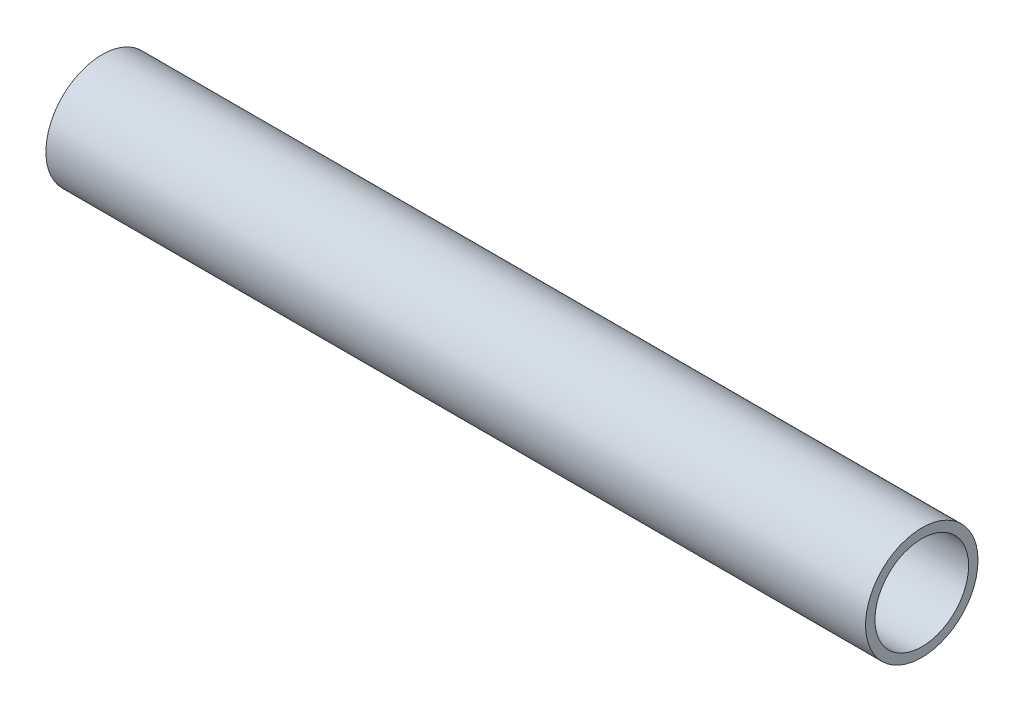
ISO-10303-21;
HEADER;
FILE_DESCRIPTION(('STEP AP214'),'2;1');
FILE_NAME('part.step','',(''),(''),'','','');
FILE_SCHEMA(('AUTOMOTIVE_DESIGN { 1 0 10303 214 1 1 1 1 }'));
ENDSEC;
DATA;
#1=APPLICATION_CONTEXT('core data for automotive mechanical design processes');
#2=APPLICATION_PROTOCOL_DEFINITION('international standard','automotive_design',2000,#1);
#3=PRODUCT_CONTEXT('',#1,'mechanical');
#4=PRODUCT('Part','Part','',(#3));
#5=PRODUCT_RELATED_PRODUCT_CATEGORY('part','',(#4));
#6=PRODUCT_DEFINITION_FORMATION('','',#4);
#7=PRODUCT_DEFINITION_CONTEXT('part definition',#1,'design');
#8=PRODUCT_DEFINITION('design','',#6,#7);
#9=PRODUCT_DEFINITION_SHAPE('','',#8);
#10=(LENGTH_UNIT() NAMED_UNIT(*) SI_UNIT(.MILLI.,.METRE.));
#11=(NAMED_UNIT(*) PLANE_ANGLE_UNIT() SI_UNIT($,.RADIAN.));
#12=(NAMED_UNIT(*) SI_UNIT($,.STERADIAN.) SOLID_ANGLE_UNIT());
#13=UNCERTAINTY_MEASURE_WITH_UNIT(LENGTH_MEASURE(1.E-05),#10,'distance_accuracy_value','');
#14=(GEOMETRIC_REPRESENTATION_CONTEXT(3) GLOBAL_UNCERTAINTY_ASSIGNED_CONTEXT((#13)) GLOBAL_UNIT_ASSIGNED_CONTEXT((#10,
#11,#12)) REPRESENTATION_CONTEXT('',''));
#15=CARTESIAN_POINT('',(0.,0.,0.));
#16=DIRECTION('',(0.,0.,1.));
#17=DIRECTION('',(1.,0.,0.));
#18=AXIS2_PLACEMENT_3D('',#15,#16,#17);
#19=CARTESIAN_POINT('',(35.,0.,0.));
#20=DIRECTION('',(1.,0.,0.));
#21=DIRECTION('',(0.,0.,-1.));
#22=AXIS2_PLACEMENT_3D('',#19,#20,#21);
#23=PLANE('',#22);
#24=CARTESIAN_POINT('',(35.,0.,0.));
#25=DIRECTION('',(1.,0.,0.));
#26=DIRECTION('',(0.,0.,-1.));
#27=AXIS2_PLACEMENT_3D('',#24,#25,#26);
#28=CIRCLE('',#27,2.4);
#29=CARTESIAN_POINT('',(35.,0.,-2.4));
#30=VERTEX_POINT('',#29);
#31=EDGE_CURVE('E10',#30,#30,#28,.T.);
#32=ORIENTED_EDGE('',*,*,#31,.T.);
#33=EDGE_LOOP('',(#32));
#34=FACE_BOUND('',#33,.T.);
#35=CARTESIAN_POINT('',(35.,0.,0.));
#36=DIRECTION('',(1.,0.,0.));
#37=DIRECTION('',(0.,0.,-1.));
#38=AXIS2_PLACEMENT_3D('',#35,#36,#37);
#39=CIRCLE('',#38,2.);
#40=CARTESIAN_POINT('',(35.,0.,-2.));
#41=VERTEX_POINT('',#40);
#42=EDGE_CURVE('E42',#41,#41,#39,.T.);
#43=ORIENTED_EDGE('',*,*,#42,.F.);
#44=EDGE_LOOP('',(#43));
#45=FACE_BOUND('',#44,.T.);
#46=ADVANCED_FACE('F31',(#34,#45),#23,.T.);
#47=CARTESIAN_POINT('',(0.,0.,0.));
#48=DIRECTION('',(1.,0.,0.));
#49=DIRECTION('',(0.,0.,-1.));
#50=AXIS2_PLACEMENT_3D('',#47,#48,#49);
#51=PLANE('',#50);
#52=CARTESIAN_POINT('',(0.,0.,0.));
#53=DIRECTION('',(1.,0.,0.));
#54=DIRECTION('',(0.,0.,-1.));
#55=AXIS2_PLACEMENT_3D('',#52,#53,#54);
#56=CIRCLE('',#55,2.4);
#57=CARTESIAN_POINT('',(0.,0.,-2.4));
#58=VERTEX_POINT('',#57);
#59=EDGE_CURVE('E35',#58,#58,#56,.T.);
#60=ORIENTED_EDGE('',*,*,#59,.F.);
#61=EDGE_LOOP('',(#60));
#62=FACE_BOUND('',#61,.T.);
#63=CARTESIAN_POINT('',(0.,0.,0.));
#64=DIRECTION('',(1.,0.,0.));
#65=DIRECTION('',(0.,0.,-1.));
#66=AXIS2_PLACEMENT_3D('',#63,#64,#65);
#67=CIRCLE('',#66,2.);
#68=CARTESIAN_POINT('',(0.,0.,-2.));
#69=VERTEX_POINT('',#68);
#70=EDGE_CURVE('E44',#69,#69,#67,.T.);
#71=ORIENTED_EDGE('',*,*,#70,.T.);
#72=EDGE_LOOP('',(#71));
#73=FACE_BOUND('',#72,.T.);
#74=ADVANCED_FACE('F54',(#62,#73),#51,.F.);
#75=CARTESIAN_POINT('',(35.,0.,0.));
#76=DIRECTION('',(-1.,0.,0.));
#77=DIRECTION('',(0.,0.,1.));
#78=AXIS2_PLACEMENT_3D('',#75,#76,#77);
#79=CYLINDRICAL_SURFACE('',#78,2.4);
#80=ORIENTED_EDGE('',*,*,#31,.F.);
#81=EDGE_LOOP('',(#80));
#82=FACE_BOUND('',#81,.T.);
#83=ORIENTED_EDGE('',*,*,#59,.T.);
#84=EDGE_LOOP('',(#83));
#85=FACE_BOUND('',#84,.T.);
#86=ADVANCED_FACE('F33',(#82,#85),#79,.T.);
#87=CARTESIAN_POINT('',(35.,0.,0.));
#88=DIRECTION('',(-1.,0.,0.));
#89=DIRECTION('',(0.,0.,1.));
#90=AXIS2_PLACEMENT_3D('',#87,#88,#89);
#91=CYLINDRICAL_SURFACE('',#90,2.);
#92=ORIENTED_EDGE('',*,*,#42,.T.);
#93=EDGE_LOOP('',(#92));
#94=FACE_BOUND('',#93,.T.);
#95=ORIENTED_EDGE('',*,*,#70,.F.);
#96=EDGE_LOOP('',(#95));
#97=FACE_BOUND('',#96,.T.);
#98=ADVANCED_FACE('F50',(#94,#97),#91,.F.);
#99=CLOSED_SHELL('',(#46,#74,#86,#98));
#100=MANIFOLD_SOLID_BREP('B2',#99);
#101=ADVANCED_BREP_SHAPE_REPRESENTATION('',(#18,#100),#14);
#102=SHAPE_DEFINITION_REPRESENTATION(#9,#101);
ENDSEC;
END-ISO-10303-21;
